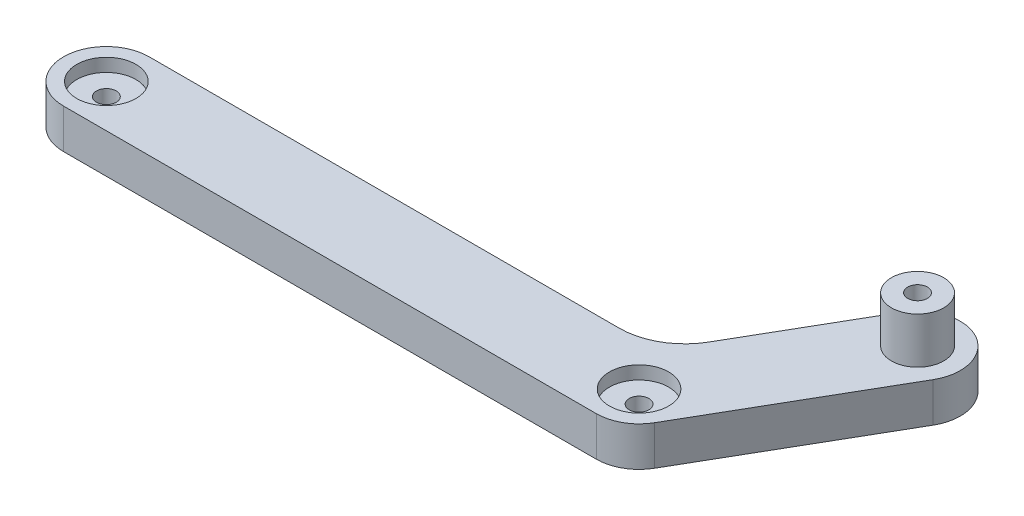
ISO-10303-21;
HEADER;
FILE_DESCRIPTION(('STEP AP214'),'2;1');
FILE_NAME('part.step','',(''),(''),'','','');
FILE_SCHEMA(('AUTOMOTIVE_DESIGN { 1 0 10303 214 1 1 1 1 }'));
ENDSEC;
DATA;
#1=APPLICATION_CONTEXT('core data for automotive mechanical design processes');
#2=APPLICATION_PROTOCOL_DEFINITION('international standard','automotive_design',2000,#1);
#3=PRODUCT_CONTEXT('',#1,'mechanical');
#4=PRODUCT('Part','Part','',(#3));
#5=PRODUCT_RELATED_PRODUCT_CATEGORY('part','',(#4));
#6=PRODUCT_DEFINITION_FORMATION('','',#4);
#7=PRODUCT_DEFINITION_CONTEXT('part definition',#1,'design');
#8=PRODUCT_DEFINITION('design','',#6,#7);
#9=PRODUCT_DEFINITION_SHAPE('','',#8);
#10=(LENGTH_UNIT() NAMED_UNIT(*) SI_UNIT(.MILLI.,.METRE.));
#11=(NAMED_UNIT(*) PLANE_ANGLE_UNIT() SI_UNIT($,.RADIAN.));
#12=(NAMED_UNIT(*) SI_UNIT($,.STERADIAN.) SOLID_ANGLE_UNIT());
#13=UNCERTAINTY_MEASURE_WITH_UNIT(LENGTH_MEASURE(1.E-05),#10,'distance_accuracy_value','');
#14=(GEOMETRIC_REPRESENTATION_CONTEXT(3) GLOBAL_UNCERTAINTY_ASSIGNED_CONTEXT((#13)) GLOBAL_UNIT_ASSIGNED_CONTEXT((#10,
#11,#12)) REPRESENTATION_CONTEXT('',''));
#15=CARTESIAN_POINT('',(0.,0.,0.));
#16=DIRECTION('',(0.,0.,1.));
#17=DIRECTION('',(1.,0.,0.));
#18=AXIS2_PLACEMENT_3D('',#15,#16,#17);
#19=CARTESIAN_POINT('',(0.,6.,0.));
#20=DIRECTION('',(0.,1.,0.));
#21=DIRECTION('',(0.,0.,1.));
#22=AXIS2_PLACEMENT_3D('',#19,#20,#21);
#23=PLANE('',#22);
#24=CARTESIAN_POINT('',(0.,6.,0.));
#25=DIRECTION('',(0.,1.,0.));
#26=DIRECTION('',(0.,0.,1.));
#27=AXIS2_PLACEMENT_3D('',#24,#25,#26);
#28=CIRCLE('',#27,6.5);
#29=CARTESIAN_POINT('',(0.,6.,-6.5));
#30=VERTEX_POINT('',#29);
#31=CARTESIAN_POINT('',(0.,6.,6.5));
#32=VERTEX_POINT('',#31);
#33=EDGE_CURVE('E154',#30,#32,#28,.T.);
#34=ORIENTED_EDGE('',*,*,#33,.T.);
#35=DIRECTION('',(1.,0.,0.));
#36=VECTOR('',#35,1.);
#37=CARTESIAN_POINT('',(0.,6.,6.5));
#38=LINE('',#37,#36);
#39=CARTESIAN_POINT('',(81.,6.,6.50000000000001));
#40=VERTEX_POINT('',#39);
#41=EDGE_CURVE('E102',#32,#40,#38,.T.);
#42=ORIENTED_EDGE('',*,*,#41,.T.);
#43=CARTESIAN_POINT('',(81.,6.,0.));
#44=DIRECTION('',(0.,1.,0.));
#45=DIRECTION('',(0.,0.,1.));
#46=AXIS2_PLACEMENT_3D('',#43,#44,#45);
#47=CIRCLE('',#46,6.50000000000001);
#48=CARTESIAN_POINT('',(86.6291651245989,6.,3.25));
#49=VERTEX_POINT('',#48);
#50=EDGE_CURVE('E199',#40,#49,#47,.T.);
#51=ORIENTED_EDGE('',*,*,#50,.T.);
#52=DIRECTION('',(0.499999999999998,0.,-0.86602540378444));
#53=VECTOR('',#52,1.);
#54=CARTESIAN_POINT('',(86.6291651245989,6.,3.25));
#55=LINE('',#54,#53);
#56=CARTESIAN_POINT('',(102.129165124599,6.,-23.5967875173176));
#57=VERTEX_POINT('',#56);
#58=EDGE_CURVE('E201',#49,#57,#55,.T.);
#59=ORIENTED_EDGE('',*,*,#58,.T.);
#60=CARTESIAN_POINT('',(96.4999999999999,6.,-26.8467875173176));
#61=DIRECTION('',(0.,1.,0.));
#62=DIRECTION('',(0.,0.,1.));
#63=AXIS2_PLACEMENT_3D('',#60,#61,#62);
#64=CIRCLE('',#63,6.50000000000002);
#65=CARTESIAN_POINT('',(90.8708348754011,6.,-30.0967875173176));
#66=VERTEX_POINT('',#65);
#67=EDGE_CURVE('E121',#57,#66,#64,.T.);
#68=ORIENTED_EDGE('',*,*,#67,.T.);
#69=DIRECTION('',(-0.499999999999996,0.,0.866025403784441));
#70=VECTOR('',#69,1.);
#71=CARTESIAN_POINT('',(80.1339745962156,6.,-11.5));
#72=LINE('',#71,#70);
#73=CARTESIAN_POINT('',(80.1339745962156,6.,-11.5));
#74=VERTEX_POINT('',#73);
#75=EDGE_CURVE('E115',#66,#74,#72,.T.);
#76=ORIENTED_EDGE('',*,*,#75,.T.);
#77=CARTESIAN_POINT('',(71.4737205583711,6.,-16.5));
#78=DIRECTION('',(0.,-1.,0.));
#79=DIRECTION('',(0.,0.,-1.));
#80=AXIS2_PLACEMENT_3D('',#77,#78,#79);
#81=CIRCLE('',#80,10.);
#82=CARTESIAN_POINT('',(71.4737205583711,6.,-6.5));
#83=VERTEX_POINT('',#82);
#84=EDGE_CURVE('E119',#74,#83,#81,.T.);
#85=ORIENTED_EDGE('',*,*,#84,.T.);
#86=DIRECTION('',(-1.,0.,0.));
#87=VECTOR('',#86,1.);
#88=CARTESIAN_POINT('',(0.,6.,-6.5));
#89=LINE('',#88,#87);
#90=EDGE_CURVE('E59',#83,#30,#89,.T.);
#91=ORIENTED_EDGE('',*,*,#90,.T.);
#92=EDGE_LOOP('',(#34,#42,#51,#59,#68,#76,#85,#91));
#93=FACE_BOUND('',#92,.T.);
#94=CARTESIAN_POINT('',(0.,6.,0.));
#95=DIRECTION('',(0.,1.,0.));
#96=DIRECTION('',(0.,0.,1.));
#97=AXIS2_PLACEMENT_3D('',#94,#95,#96);
#98=CIRCLE('',#97,4.5);
#99=CARTESIAN_POINT('',(0.,6.,4.5));
#100=VERTEX_POINT('',#99);
#101=EDGE_CURVE('E178',#100,#100,#98,.T.);
#102=ORIENTED_EDGE('',*,*,#101,.F.);
#103=EDGE_LOOP('',(#102));
#104=FACE_BOUND('',#103,.T.);
#105=CARTESIAN_POINT('',(81.,6.,0.));
#106=DIRECTION('',(0.,1.,0.));
#107=DIRECTION('',(0.,0.,1.));
#108=AXIS2_PLACEMENT_3D('',#105,#106,#107);
#109=CIRCLE('',#108,4.49999999999999);
#110=CARTESIAN_POINT('',(81.,6.,4.49999999999999));
#111=VERTEX_POINT('',#110);
#112=EDGE_CURVE('E173',#111,#111,#109,.T.);
#113=ORIENTED_EDGE('',*,*,#112,.F.);
#114=EDGE_LOOP('',(#113));
#115=FACE_BOUND('',#114,.T.);
#116=CARTESIAN_POINT('',(96.4999999999999,6.,-26.8467875173176));
#117=DIRECTION('',(0.,1.,0.));
#118=DIRECTION('',(0.,0.,1.));
#119=AXIS2_PLACEMENT_3D('',#116,#117,#118);
#120=CIRCLE('',#119,3.97500000000001);
#121=CARTESIAN_POINT('',(96.4999999999999,6.,-22.8717875173176));
#122=VERTEX_POINT('',#121);
#123=EDGE_CURVE('E181',#122,#122,#120,.T.);
#124=ORIENTED_EDGE('',*,*,#123,.F.);
#125=EDGE_LOOP('',(#124));
#126=FACE_BOUND('',#125,.T.);
#127=ADVANCED_FACE('F40',(#93,#104,#115,#126),#23,.T.);
#128=CARTESIAN_POINT('',(0.,6.,0.));
#129=DIRECTION('',(0.,-1.,0.));
#130=DIRECTION('',(0.,0.,-1.));
#131=AXIS2_PLACEMENT_3D('',#128,#129,#130);
#132=CYLINDRICAL_SURFACE('',#131,1.5);
#133=CARTESIAN_POINT('',(0.,0.,0.));
#134=DIRECTION('',(0.,1.,0.));
#135=DIRECTION('',(0.,0.,1.));
#136=AXIS2_PLACEMENT_3D('',#133,#134,#135);
#137=CIRCLE('',#136,1.5);
#138=CARTESIAN_POINT('',(0.,0.,1.5));
#139=VERTEX_POINT('',#138);
#140=EDGE_CURVE('E143',#139,#139,#137,.T.);
#141=ORIENTED_EDGE('',*,*,#140,.F.);
#142=EDGE_LOOP('',(#141));
#143=FACE_BOUND('',#142,.T.);
#144=CARTESIAN_POINT('',(0.,4.,0.));
#145=DIRECTION('',(0.,1.,0.));
#146=DIRECTION('',(0.,0.,1.));
#147=AXIS2_PLACEMENT_3D('',#144,#145,#146);
#148=CIRCLE('',#147,1.5);
#149=CARTESIAN_POINT('',(0.,4.,1.5));
#150=VERTEX_POINT('',#149);
#151=EDGE_CURVE('E44',#150,#150,#148,.T.);
#152=ORIENTED_EDGE('',*,*,#151,.T.);
#153=EDGE_LOOP('',(#152));
#154=FACE_BOUND('',#153,.T.);
#155=ADVANCED_FACE('F234',(#143,#154),#132,.F.);
#156=CARTESIAN_POINT('',(81.,6.,0.));
#157=DIRECTION('',(0.,-1.,0.));
#158=DIRECTION('',(0.,0.,-1.));
#159=AXIS2_PLACEMENT_3D('',#156,#157,#158);
#160=CYLINDRICAL_SURFACE('',#159,1.5);
#161=CARTESIAN_POINT('',(81.,0.,0.));
#162=DIRECTION('',(0.,1.,0.));
#163=DIRECTION('',(0.,0.,1.));
#164=AXIS2_PLACEMENT_3D('',#161,#162,#163);
#165=CIRCLE('',#164,1.5);
#166=CARTESIAN_POINT('',(81.,0.,1.5));
#167=VERTEX_POINT('',#166);
#168=EDGE_CURVE('E192',#167,#167,#165,.T.);
#169=ORIENTED_EDGE('',*,*,#168,.F.);
#170=EDGE_LOOP('',(#169));
#171=FACE_BOUND('',#170,.T.);
#172=CARTESIAN_POINT('',(81.,4.,0.));
#173=DIRECTION('',(0.,1.,0.));
#174=DIRECTION('',(0.,0.,1.));
#175=AXIS2_PLACEMENT_3D('',#172,#173,#174);
#176=CIRCLE('',#175,1.5);
#177=CARTESIAN_POINT('',(81.,4.,1.5));
#178=VERTEX_POINT('',#177);
#179=EDGE_CURVE('E165',#178,#178,#176,.T.);
#180=ORIENTED_EDGE('',*,*,#179,.T.);
#181=EDGE_LOOP('',(#180));
#182=FACE_BOUND('',#181,.T.);
#183=ADVANCED_FACE('F239',(#171,#182),#160,.F.);
#184=CARTESIAN_POINT('',(0.,0.,0.));
#185=DIRECTION('',(0.,1.,0.));
#186=DIRECTION('',(0.,0.,1.));
#187=AXIS2_PLACEMENT_3D('',#184,#185,#186);
#188=PLANE('',#187);
#189=CARTESIAN_POINT('',(0.,0.,0.));
#190=DIRECTION('',(0.,1.,0.));
#191=DIRECTION('',(0.,0.,1.));
#192=AXIS2_PLACEMENT_3D('',#189,#190,#191);
#193=CIRCLE('',#192,6.5);
#194=CARTESIAN_POINT('',(0.,0.,-6.5));
#195=VERTEX_POINT('',#194);
#196=CARTESIAN_POINT('',(0.,0.,6.5));
#197=VERTEX_POINT('',#196);
#198=EDGE_CURVE('E139',#195,#197,#193,.T.);
#199=ORIENTED_EDGE('',*,*,#198,.F.);
#200=DIRECTION('',(-1.,0.,0.));
#201=VECTOR('',#200,1.);
#202=CARTESIAN_POINT('',(0.,0.,-6.5));
#203=LINE('',#202,#201);
#204=CARTESIAN_POINT('',(71.4737205583711,0.,-6.5));
#205=VERTEX_POINT('',#204);
#206=EDGE_CURVE('E94',#205,#195,#203,.T.);
#207=ORIENTED_EDGE('',*,*,#206,.F.);
#208=CARTESIAN_POINT('',(71.4737205583711,0.,-16.5));
#209=DIRECTION('',(0.,-1.,0.));
#210=DIRECTION('',(0.,0.,-1.));
#211=AXIS2_PLACEMENT_3D('',#208,#209,#210);
#212=CIRCLE('',#211,10.);
#213=CARTESIAN_POINT('',(80.1339745962156,0.,-11.5));
#214=VERTEX_POINT('',#213);
#215=EDGE_CURVE('E88',#214,#205,#212,.T.);
#216=ORIENTED_EDGE('',*,*,#215,.F.);
#217=DIRECTION('',(-0.499999999999996,0.,0.866025403784441));
#218=VECTOR('',#217,1.);
#219=CARTESIAN_POINT('',(80.1339745962156,0.,-11.5));
#220=LINE('',#219,#218);
#221=CARTESIAN_POINT('',(90.8708348754011,0.,-30.0967875173176));
#222=VERTEX_POINT('',#221);
#223=EDGE_CURVE('E129',#222,#214,#220,.T.);
#224=ORIENTED_EDGE('',*,*,#223,.F.);
#225=CARTESIAN_POINT('',(96.4999999999999,0.,-26.8467875173176));
#226=DIRECTION('',(0.,1.,0.));
#227=DIRECTION('',(0.,0.,1.));
#228=AXIS2_PLACEMENT_3D('',#225,#226,#227);
#229=CIRCLE('',#228,6.50000000000002);
#230=CARTESIAN_POINT('',(102.129165124599,0.,-23.5967875173176));
#231=VERTEX_POINT('',#230);
#232=EDGE_CURVE('E149',#231,#222,#229,.T.);
#233=ORIENTED_EDGE('',*,*,#232,.F.);
#234=DIRECTION('',(0.499999999999998,0.,-0.86602540378444));
#235=VECTOR('',#234,1.);
#236=CARTESIAN_POINT('',(86.6291651245989,0.,3.25));
#237=LINE('',#236,#235);
#238=CARTESIAN_POINT('',(86.6291651245989,0.,3.25));
#239=VERTEX_POINT('',#238);
#240=EDGE_CURVE('E147',#239,#231,#237,.T.);
#241=ORIENTED_EDGE('',*,*,#240,.F.);
#242=CARTESIAN_POINT('',(81.,0.,0.));
#243=DIRECTION('',(0.,1.,0.));
#244=DIRECTION('',(0.,0.,1.));
#245=AXIS2_PLACEMENT_3D('',#242,#243,#244);
#246=CIRCLE('',#245,6.50000000000001);
#247=CARTESIAN_POINT('',(81.,0.,6.50000000000001));
#248=VERTEX_POINT('',#247);
#249=EDGE_CURVE('E145',#248,#239,#246,.T.);
#250=ORIENTED_EDGE('',*,*,#249,.F.);
#251=DIRECTION('',(1.,0.,0.));
#252=VECTOR('',#251,1.);
#253=CARTESIAN_POINT('',(0.,0.,6.5));
#254=LINE('',#253,#252);
#255=EDGE_CURVE('E142',#197,#248,#254,.T.);
#256=ORIENTED_EDGE('',*,*,#255,.F.);
#257=EDGE_LOOP('',(#199,#207,#216,#224,#233,#241,#250,#256));
#258=FACE_BOUND('',#257,.T.);
#259=ORIENTED_EDGE('',*,*,#140,.T.);
#260=EDGE_LOOP('',(#259));
#261=FACE_BOUND('',#260,.T.);
#262=ORIENTED_EDGE('',*,*,#168,.T.);
#263=EDGE_LOOP('',(#262));
#264=FACE_BOUND('',#263,.T.);
#265=CARTESIAN_POINT('',(96.4999999999999,0.,-26.8467875173176));
#266=DIRECTION('',(0.,1.,0.));
#267=DIRECTION('',(0.,0.,1.));
#268=AXIS2_PLACEMENT_3D('',#265,#266,#267);
#269=CIRCLE('',#268,1.5);
#270=CARTESIAN_POINT('',(96.4999999999999,0.,-25.3467875173176));
#271=VERTEX_POINT('',#270);
#272=EDGE_CURVE('E171',#271,#271,#269,.T.);
#273=ORIENTED_EDGE('',*,*,#272,.T.);
#274=EDGE_LOOP('',(#273));
#275=FACE_BOUND('',#274,.T.);
#276=ADVANCED_FACE('F214',(#258,#261,#264,#275),#188,.F.);
#277=CARTESIAN_POINT('',(0.,6.,0.));
#278=DIRECTION('',(0.,-1.,0.));
#279=DIRECTION('',(0.,0.,-1.));
#280=AXIS2_PLACEMENT_3D('',#277,#278,#279);
#281=CYLINDRICAL_SURFACE('',#280,6.5);
#282=ORIENTED_EDGE('',*,*,#198,.T.);
#283=DIRECTION('',(0.,-1.,0.));
#284=VECTOR('',#283,1.);
#285=CARTESIAN_POINT('',(0.,6.,6.5));
#286=LINE('',#285,#284);
#287=EDGE_CURVE('E11',#32,#197,#286,.T.);
#288=ORIENTED_EDGE('',*,*,#287,.F.);
#289=ORIENTED_EDGE('',*,*,#33,.F.);
#290=DIRECTION('',(0.,-1.,0.));
#291=VECTOR('',#290,1.);
#292=CARTESIAN_POINT('',(0.,6.,-6.5));
#293=LINE('',#292,#291);
#294=EDGE_CURVE('E135',#30,#195,#293,.T.);
#295=ORIENTED_EDGE('',*,*,#294,.T.);
#296=EDGE_LOOP('',(#282,#288,#289,#295));
#297=FACE_BOUND('',#296,.T.);
#298=ADVANCED_FACE('F42',(#297),#281,.T.);
#299=CARTESIAN_POINT('',(0.,6.,6.5));
#300=DIRECTION('',(0.,0.,-1.));
#301=DIRECTION('',(-1.,0.,0.));
#302=AXIS2_PLACEMENT_3D('',#299,#300,#301);
#303=PLANE('',#302);
#304=ORIENTED_EDGE('',*,*,#255,.T.);
#305=DIRECTION('',(0.,-1.,0.));
#306=VECTOR('',#305,1.);
#307=CARTESIAN_POINT('',(81.,6.,6.50000000000001));
#308=LINE('',#307,#306);
#309=EDGE_CURVE('E50',#40,#248,#308,.T.);
#310=ORIENTED_EDGE('',*,*,#309,.F.);
#311=ORIENTED_EDGE('',*,*,#41,.F.);
#312=ORIENTED_EDGE('',*,*,#287,.T.);
#313=EDGE_LOOP('',(#304,#310,#311,#312));
#314=FACE_BOUND('',#313,.T.);
#315=ADVANCED_FACE('F248',(#314),#303,.F.);
#316=CARTESIAN_POINT('',(81.,6.,0.));
#317=DIRECTION('',(0.,-1.,0.));
#318=DIRECTION('',(0.,0.,-1.));
#319=AXIS2_PLACEMENT_3D('',#316,#317,#318);
#320=CYLINDRICAL_SURFACE('',#319,6.50000000000001);
#321=ORIENTED_EDGE('',*,*,#249,.T.);
#322=DIRECTION('',(0.,-1.,0.));
#323=VECTOR('',#322,1.);
#324=CARTESIAN_POINT('',(86.6291651245989,6.,3.25));
#325=LINE('',#324,#323);
#326=EDGE_CURVE('E161',#49,#239,#325,.T.);
#327=ORIENTED_EDGE('',*,*,#326,.F.);
#328=ORIENTED_EDGE('',*,*,#50,.F.);
#329=ORIENTED_EDGE('',*,*,#309,.T.);
#330=EDGE_LOOP('',(#321,#327,#328,#329));
#331=FACE_BOUND('',#330,.T.);
#332=ADVANCED_FACE('F392',(#331),#320,.T.);
#333=CARTESIAN_POINT('',(86.6291651245989,6.,3.25));
#334=DIRECTION('',(-0.86602540378444,0.,-0.499999999999998));
#335=DIRECTION('',(-0.499999999999998,0.,0.86602540378444));
#336=AXIS2_PLACEMENT_3D('',#333,#334,#335);
#337=PLANE('',#336);
#338=ORIENTED_EDGE('',*,*,#240,.T.);
#339=DIRECTION('',(0.,-1.,0.));
#340=VECTOR('',#339,1.);
#341=CARTESIAN_POINT('',(102.129165124599,6.,-23.5967875173176));
#342=LINE('',#341,#340);
#343=EDGE_CURVE('E158',#57,#231,#342,.T.);
#344=ORIENTED_EDGE('',*,*,#343,.F.);
#345=ORIENTED_EDGE('',*,*,#58,.F.);
#346=ORIENTED_EDGE('',*,*,#326,.T.);
#347=EDGE_LOOP('',(#338,#344,#345,#346));
#348=FACE_BOUND('',#347,.T.);
#349=ADVANCED_FACE('F207',(#348),#337,.F.);
#350=CARTESIAN_POINT('',(96.4999999999999,6.,-26.8467875173176));
#351=DIRECTION('',(0.,-1.,0.));
#352=DIRECTION('',(0.,0.,-1.));
#353=AXIS2_PLACEMENT_3D('',#350,#351,#352);
#354=CYLINDRICAL_SURFACE('',#353,6.50000000000002);
#355=ORIENTED_EDGE('',*,*,#232,.T.);
#356=DIRECTION('',(0.,-1.,0.));
#357=VECTOR('',#356,1.);
#358=CARTESIAN_POINT('',(90.8708348754011,6.,-30.0967875173176));
#359=LINE('',#358,#357);
#360=EDGE_CURVE('E130',#66,#222,#359,.T.);
#361=ORIENTED_EDGE('',*,*,#360,.F.);
#362=ORIENTED_EDGE('',*,*,#67,.F.);
#363=ORIENTED_EDGE('',*,*,#343,.T.);
#364=EDGE_LOOP('',(#355,#361,#362,#363));
#365=FACE_BOUND('',#364,.T.);
#366=ADVANCED_FACE('F211',(#365),#354,.T.);
#367=CARTESIAN_POINT('',(80.1339745962156,6.,-11.5));
#368=DIRECTION('',(0.866025403784441,0.,0.499999999999996));
#369=DIRECTION('',(0.499999999999996,0.,-0.866025403784441));
#370=AXIS2_PLACEMENT_3D('',#367,#368,#369);
#371=PLANE('',#370);
#372=ORIENTED_EDGE('',*,*,#223,.T.);
#373=DIRECTION('',(0.,-1.,0.));
#374=VECTOR('',#373,1.);
#375=CARTESIAN_POINT('',(80.1339745962156,6.,-11.5));
#376=LINE('',#375,#374);
#377=EDGE_CURVE('E126',#74,#214,#376,.T.);
#378=ORIENTED_EDGE('',*,*,#377,.F.);
#379=ORIENTED_EDGE('',*,*,#75,.F.);
#380=ORIENTED_EDGE('',*,*,#360,.T.);
#381=EDGE_LOOP('',(#372,#378,#379,#380));
#382=FACE_BOUND('',#381,.T.);
#383=ADVANCED_FACE('F127',(#382),#371,.F.);
#384=CARTESIAN_POINT('',(71.4737205583711,6.,-16.5));
#385=DIRECTION('',(0.,-1.,0.));
#386=DIRECTION('',(0.,0.,-1.));
#387=AXIS2_PLACEMENT_3D('',#384,#385,#386);
#388=CYLINDRICAL_SURFACE('',#387,10.);
#389=ORIENTED_EDGE('',*,*,#215,.T.);
#390=DIRECTION('',(0.,-1.,0.));
#391=VECTOR('',#390,1.);
#392=CARTESIAN_POINT('',(71.4737205583711,6.,-6.5));
#393=LINE('',#392,#391);
#394=EDGE_CURVE('E131',#83,#205,#393,.T.);
#395=ORIENTED_EDGE('',*,*,#394,.F.);
#396=ORIENTED_EDGE('',*,*,#84,.F.);
#397=ORIENTED_EDGE('',*,*,#377,.T.);
#398=EDGE_LOOP('',(#389,#395,#396,#397));
#399=FACE_BOUND('',#398,.T.);
#400=ADVANCED_FACE('F133',(#399),#388,.F.);
#401=CARTESIAN_POINT('',(0.,6.,-6.5));
#402=DIRECTION('',(0.,0.,1.));
#403=DIRECTION('',(1.,0.,0.));
#404=AXIS2_PLACEMENT_3D('',#401,#402,#403);
#405=PLANE('',#404);
#406=ORIENTED_EDGE('',*,*,#206,.T.);
#407=ORIENTED_EDGE('',*,*,#294,.F.);
#408=ORIENTED_EDGE('',*,*,#90,.F.);
#409=ORIENTED_EDGE('',*,*,#394,.T.);
#410=EDGE_LOOP('',(#406,#407,#408,#409));
#411=FACE_BOUND('',#410,.T.);
#412=ADVANCED_FACE('F220',(#411),#405,.F.);
#413=CARTESIAN_POINT('',(96.4999999999999,6.,-26.8467875173176));
#414=DIRECTION('',(0.,-1.,0.));
#415=DIRECTION('',(0.,0.,-1.));
#416=AXIS2_PLACEMENT_3D('',#413,#414,#415);
#417=CYLINDRICAL_SURFACE('',#416,1.5);
#418=ORIENTED_EDGE('',*,*,#272,.F.);
#419=EDGE_LOOP('',(#418));
#420=FACE_BOUND('',#419,.T.);
#421=CARTESIAN_POINT('',(96.4999999999999,13.,-26.8467875173176));
#422=DIRECTION('',(0.,1.,0.));
#423=DIRECTION('',(0.,0.,1.));
#424=AXIS2_PLACEMENT_3D('',#421,#422,#423);
#425=CIRCLE('',#424,1.5);
#426=CARTESIAN_POINT('',(96.4999999999999,13.,-25.3467875173176));
#427=VERTEX_POINT('',#426);
#428=EDGE_CURVE('E283',#427,#427,#425,.T.);
#429=ORIENTED_EDGE('',*,*,#428,.T.);
#430=EDGE_LOOP('',(#429));
#431=FACE_BOUND('',#430,.T.);
#432=ADVANCED_FACE('F222',(#420,#431),#417,.F.);
#433=CARTESIAN_POINT('',(81.,4.,0.));
#434=DIRECTION('',(0.,1.,0.));
#435=DIRECTION('',(0.,0.,1.));
#436=AXIS2_PLACEMENT_3D('',#433,#434,#435);
#437=CYLINDRICAL_SURFACE('',#436,4.49999999999999);
#438=CARTESIAN_POINT('',(81.,4.,0.));
#439=DIRECTION('',(0.,1.,0.));
#440=DIRECTION('',(0.,0.,1.));
#441=AXIS2_PLACEMENT_3D('',#438,#439,#440);
#442=CIRCLE('',#441,4.49999999999999);
#443=CARTESIAN_POINT('',(81.,4.,4.49999999999999));
#444=VERTEX_POINT('',#443);
#445=EDGE_CURVE('E167',#444,#444,#442,.T.);
#446=ORIENTED_EDGE('',*,*,#445,.F.);
#447=EDGE_LOOP('',(#446));
#448=FACE_BOUND('',#447,.T.);
#449=ORIENTED_EDGE('',*,*,#112,.T.);
#450=EDGE_LOOP('',(#449));
#451=FACE_BOUND('',#450,.T.);
#452=ADVANCED_FACE('F228',(#448,#451),#437,.F.);
#453=CARTESIAN_POINT('',(81.,4.,0.));
#454=DIRECTION('',(0.,1.,0.));
#455=DIRECTION('',(0.,0.,1.));
#456=AXIS2_PLACEMENT_3D('',#453,#454,#455);
#457=PLANE('',#456);
#458=ORIENTED_EDGE('',*,*,#179,.F.);
#459=EDGE_LOOP('',(#458));
#460=FACE_BOUND('',#459,.T.);
#461=ORIENTED_EDGE('',*,*,#445,.T.);
#462=EDGE_LOOP('',(#461));
#463=FACE_BOUND('',#462,.T.);
#464=ADVANCED_FACE('F262',(#460,#463),#457,.T.);
#465=CARTESIAN_POINT('',(0.,4.,0.));
#466=DIRECTION('',(0.,1.,0.));
#467=DIRECTION('',(0.,0.,1.));
#468=AXIS2_PLACEMENT_3D('',#465,#466,#467);
#469=CYLINDRICAL_SURFACE('',#468,4.5);
#470=CARTESIAN_POINT('',(0.,4.,0.));
#471=DIRECTION('',(0.,1.,0.));
#472=DIRECTION('',(0.,0.,1.));
#473=AXIS2_PLACEMENT_3D('',#470,#471,#472);
#474=CIRCLE('',#473,4.5);
#475=CARTESIAN_POINT('',(0.,4.,4.5));
#476=VERTEX_POINT('',#475);
#477=EDGE_CURVE('E186',#476,#476,#474,.T.);
#478=ORIENTED_EDGE('',*,*,#477,.F.);
#479=EDGE_LOOP('',(#478));
#480=FACE_BOUND('',#479,.T.);
#481=ORIENTED_EDGE('',*,*,#101,.T.);
#482=EDGE_LOOP('',(#481));
#483=FACE_BOUND('',#482,.T.);
#484=ADVANCED_FACE('F258',(#480,#483),#469,.F.);
#485=CARTESIAN_POINT('',(0.,4.,0.));
#486=DIRECTION('',(0.,1.,0.));
#487=DIRECTION('',(0.,0.,1.));
#488=AXIS2_PLACEMENT_3D('',#485,#486,#487);
#489=PLANE('',#488);
#490=ORIENTED_EDGE('',*,*,#151,.F.);
#491=EDGE_LOOP('',(#490));
#492=FACE_BOUND('',#491,.T.);
#493=ORIENTED_EDGE('',*,*,#477,.T.);
#494=EDGE_LOOP('',(#493));
#495=FACE_BOUND('',#494,.T.);
#496=ADVANCED_FACE('F254',(#492,#495),#489,.T.);
#497=CARTESIAN_POINT('',(96.4999999999999,13.,-26.8467875173176));
#498=DIRECTION('',(0.,1.,0.));
#499=DIRECTION('',(0.,0.,1.));
#500=AXIS2_PLACEMENT_3D('',#497,#498,#499);
#501=PLANE('',#500);
#502=CARTESIAN_POINT('',(96.4999999999999,13.,-26.8467875173176));
#503=DIRECTION('',(0.,1.,0.));
#504=DIRECTION('',(0.,0.,1.));
#505=AXIS2_PLACEMENT_3D('',#502,#503,#504);
#506=CIRCLE('',#505,3.97500000000001);
#507=CARTESIAN_POINT('',(96.4999999999999,13.,-22.8717875173176));
#508=VERTEX_POINT('',#507);
#509=EDGE_CURVE('E189',#508,#508,#506,.T.);
#510=ORIENTED_EDGE('',*,*,#509,.T.);
#511=EDGE_LOOP('',(#510));
#512=FACE_BOUND('',#511,.T.);
#513=ORIENTED_EDGE('',*,*,#428,.F.);
#514=EDGE_LOOP('',(#513));
#515=FACE_BOUND('',#514,.T.);
#516=ADVANCED_FACE('F257',(#512,#515),#501,.T.);
#517=CARTESIAN_POINT('',(96.4999999999999,13.,-26.8467875173176));
#518=DIRECTION('',(0.,-1.,0.));
#519=DIRECTION('',(0.,0.,-1.));
#520=AXIS2_PLACEMENT_3D('',#517,#518,#519);
#521=CYLINDRICAL_SURFACE('',#520,3.97500000000001);
#522=ORIENTED_EDGE('',*,*,#509,.F.);
#523=EDGE_LOOP('',(#522));
#524=FACE_BOUND('',#523,.T.);
#525=ORIENTED_EDGE('',*,*,#123,.T.);
#526=EDGE_LOOP('',(#525));
#527=FACE_BOUND('',#526,.T.);
#528=ADVANCED_FACE('F270',(#524,#527),#521,.T.);
#529=CLOSED_SHELL('',(#127,#155,#183,#276,#298,#315,#332,#349,#366,#383,#400,#412,#432,#452,
#464,#484,#496,#516,#528));
#530=MANIFOLD_SOLID_BREP('B2',#529);
#531=ADVANCED_BREP_SHAPE_REPRESENTATION('',(#18,#530),#14);
#532=SHAPE_DEFINITION_REPRESENTATION(#9,#531);
ENDSEC;
END-ISO-10303-21;
